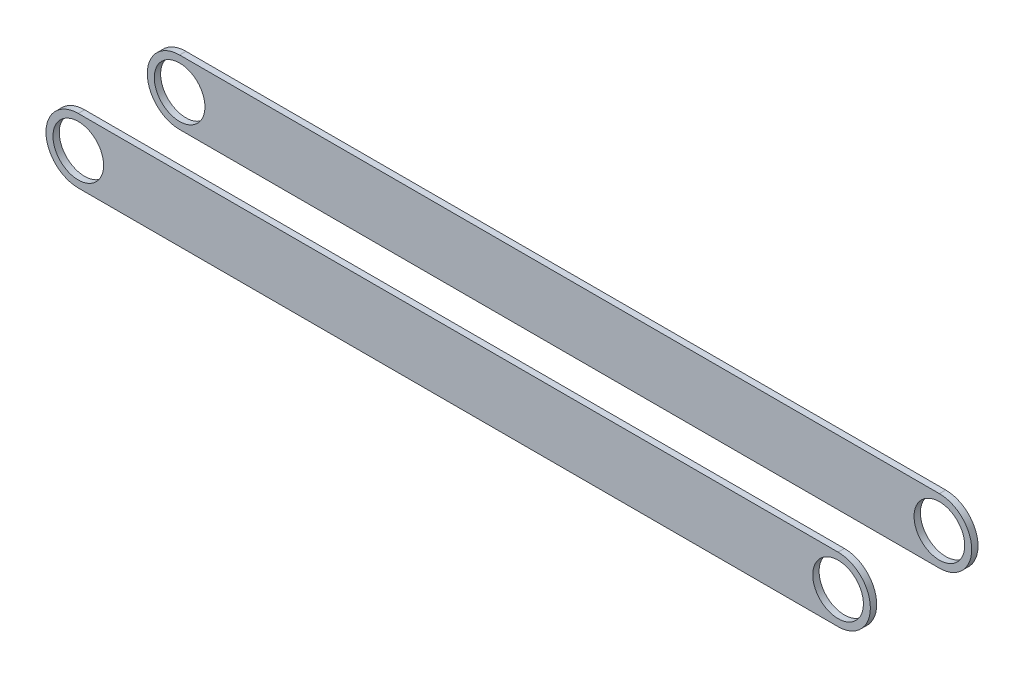
ISO-10303-21;
HEADER;
FILE_DESCRIPTION(('STEP AP214'),'2;1');
FILE_NAME('part.step','',(''),(''),'','','');
FILE_SCHEMA(('AUTOMOTIVE_DESIGN { 1 0 10303 214 1 1 1 1 }'));
ENDSEC;
DATA;
#1=APPLICATION_CONTEXT('core data for automotive mechanical design processes');
#2=APPLICATION_PROTOCOL_DEFINITION('international standard','automotive_design',2000,#1);
#3=PRODUCT_CONTEXT('',#1,'mechanical');
#4=PRODUCT('Part','Part','',(#3));
#5=PRODUCT_RELATED_PRODUCT_CATEGORY('part','',(#4));
#6=PRODUCT_DEFINITION_FORMATION('','',#4);
#7=PRODUCT_DEFINITION_CONTEXT('part definition',#1,'design');
#8=PRODUCT_DEFINITION('design','',#6,#7);
#9=PRODUCT_DEFINITION_SHAPE('','',#8);
#10=(LENGTH_UNIT() NAMED_UNIT(*) SI_UNIT(.MILLI.,.METRE.));
#11=(NAMED_UNIT(*) PLANE_ANGLE_UNIT() SI_UNIT($,.RADIAN.));
#12=(NAMED_UNIT(*) SI_UNIT($,.STERADIAN.) SOLID_ANGLE_UNIT());
#13=UNCERTAINTY_MEASURE_WITH_UNIT(LENGTH_MEASURE(1.E-05),#10,'distance_accuracy_value','');
#14=(GEOMETRIC_REPRESENTATION_CONTEXT(3) GLOBAL_UNCERTAINTY_ASSIGNED_CONTEXT((#13)) GLOBAL_UNIT_ASSIGNED_CONTEXT((#10,
#11,#12)) REPRESENTATION_CONTEXT('',''));
#15=CARTESIAN_POINT('',(0.,0.,0.));
#16=DIRECTION('',(0.,0.,1.));
#17=DIRECTION('',(1.,0.,0.));
#18=AXIS2_PLACEMENT_3D('',#15,#16,#17);
#19=CARTESIAN_POINT('',(7.24871551671669E-13,51.,160.));
#20=DIRECTION('',(0.,-1.,0.));
#21=DIRECTION('',(1.,0.,0.));
#22=AXIS2_PLACEMENT_3D('',#19,#20,#21);
#23=PLANE('',#22);
#24=DIRECTION('',(-1.,0.,0.));
#25=VECTOR('',#24,1.);
#26=CARTESIAN_POINT('',(7.24871551671669E-13,51.,170.));
#27=LINE('',#26,#25);
#28=CARTESIAN_POINT('',(7.24753589098874E-13,51.,170.));
#29=VERTEX_POINT('',#28);
#30=CARTESIAN_POINT('',(-1200.,51.0000000000171,170.));
#31=VERTEX_POINT('',#30);
#32=EDGE_CURVE('E139',#29,#31,#27,.T.);
#33=ORIENTED_EDGE('',*,*,#32,.F.);
#34=DIRECTION('',(0.,0.,1.));
#35=VECTOR('',#34,1.);
#36=CARTESIAN_POINT('',(7.24753589098874E-13,51.,160.));
#37=LINE('',#36,#35);
#38=CARTESIAN_POINT('',(7.24753589098874E-13,51.,160.));
#39=VERTEX_POINT('',#38);
#40=EDGE_CURVE('E130',#39,#29,#37,.T.);
#41=ORIENTED_EDGE('',*,*,#40,.F.);
#42=DIRECTION('',(-1.,0.,0.));
#43=VECTOR('',#42,1.);
#44=CARTESIAN_POINT('',(7.24871551671669E-13,51.,160.));
#45=LINE('',#44,#43);
#46=CARTESIAN_POINT('',(-1200.,51.0000000000171,160.));
#47=VERTEX_POINT('',#46);
#48=EDGE_CURVE('E121',#39,#47,#45,.T.);
#49=ORIENTED_EDGE('',*,*,#48,.T.);
#50=DIRECTION('',(0.,0.,1.));
#51=VECTOR('',#50,1.);
#52=CARTESIAN_POINT('',(-1200.,51.0000000000171,160.));
#53=LINE('',#52,#51);
#54=EDGE_CURVE('E12',#47,#31,#53,.T.);
#55=ORIENTED_EDGE('',*,*,#54,.T.);
#56=EDGE_LOOP('',(#33,#41,#49,#55));
#57=FACE_BOUND('',#56,.T.);
#58=ADVANCED_FACE('F59',(#57),#23,.F.);
#59=CARTESIAN_POINT('',(-1200.,1.70530256582424E-11,160.));
#60=DIRECTION('',(0.,0.,1.));
#61=DIRECTION('',(-1.,0.,0.));
#62=AXIS2_PLACEMENT_3D('',#59,#60,#61);
#63=CYLINDRICAL_SURFACE('',#62,51.);
#64=CARTESIAN_POINT('',(-1200.,1.70530256582424E-11,170.));
#65=DIRECTION('',(0.,0.,1.));
#66=DIRECTION('',(1.,0.,0.));
#67=AXIS2_PLACEMENT_3D('',#64,#65,#66);
#68=CIRCLE('',#67,51.);
#69=CARTESIAN_POINT('',(-1200.,-50.9999999999829,170.));
#70=VERTEX_POINT('',#69);
#71=EDGE_CURVE('E142',#31,#70,#68,.T.);
#72=ORIENTED_EDGE('',*,*,#71,.F.);
#73=ORIENTED_EDGE('',*,*,#54,.F.);
#74=CARTESIAN_POINT('',(-1200.,1.70530256582424E-11,160.));
#75=DIRECTION('',(0.,0.,1.));
#76=DIRECTION('',(1.,0.,0.));
#77=AXIS2_PLACEMENT_3D('',#74,#75,#76);
#78=CIRCLE('',#77,51.);
#79=CARTESIAN_POINT('',(-1200.,-50.9999999999829,160.));
#80=VERTEX_POINT('',#79);
#81=EDGE_CURVE('E102',#47,#80,#78,.T.);
#82=ORIENTED_EDGE('',*,*,#81,.T.);
#83=DIRECTION('',(0.,0.,1.));
#84=VECTOR('',#83,1.);
#85=CARTESIAN_POINT('',(-1200.,-50.9999999999829,160.));
#86=LINE('',#85,#84);
#87=EDGE_CURVE('E69',#80,#70,#86,.T.);
#88=ORIENTED_EDGE('',*,*,#87,.T.);
#89=EDGE_LOOP('',(#72,#73,#82,#88));
#90=FACE_BOUND('',#89,.T.);
#91=ADVANCED_FACE('F118',(#90),#63,.T.);
#92=CARTESIAN_POINT('',(-7.24871551671669E-13,-51.,160.));
#93=DIRECTION('',(0.,-1.,0.));
#94=DIRECTION('',(1.,0.,0.));
#95=AXIS2_PLACEMENT_3D('',#92,#93,#94);
#96=PLANE('',#95);
#97=DIRECTION('',(-1.,0.,0.));
#98=VECTOR('',#97,1.);
#99=CARTESIAN_POINT('',(-7.24871551671669E-13,-51.,170.));
#100=LINE('',#99,#98);
#101=CARTESIAN_POINT('',(-7.24753589098874E-13,-51.,170.));
#102=VERTEX_POINT('',#101);
#103=EDGE_CURVE('E113',#102,#70,#100,.T.);
#104=ORIENTED_EDGE('',*,*,#103,.T.);
#105=ORIENTED_EDGE('',*,*,#87,.F.);
#106=DIRECTION('',(-1.,0.,0.));
#107=VECTOR('',#106,1.);
#108=CARTESIAN_POINT('',(-7.24871551671669E-13,-51.,160.));
#109=LINE('',#108,#107);
#110=CARTESIAN_POINT('',(-7.24753589098874E-13,-51.,160.));
#111=VERTEX_POINT('',#110);
#112=EDGE_CURVE('E105',#111,#80,#109,.T.);
#113=ORIENTED_EDGE('',*,*,#112,.F.);
#114=DIRECTION('',(0.,0.,1.));
#115=VECTOR('',#114,1.);
#116=CARTESIAN_POINT('',(-7.24753589098874E-13,-51.,160.));
#117=LINE('',#116,#115);
#118=EDGE_CURVE('E117',#111,#102,#117,.T.);
#119=ORIENTED_EDGE('',*,*,#118,.T.);
#120=EDGE_LOOP('',(#104,#105,#113,#119));
#121=FACE_BOUND('',#120,.T.);
#122=ADVANCED_FACE('F112',(#121),#96,.T.);
#123=CARTESIAN_POINT('',(0.,0.,160.));
#124=DIRECTION('',(0.,0.,1.));
#125=DIRECTION('',(-1.,0.,0.));
#126=AXIS2_PLACEMENT_3D('',#123,#124,#125);
#127=CYLINDRICAL_SURFACE('',#126,40.);
#128=CARTESIAN_POINT('',(0.,0.,160.));
#129=DIRECTION('',(0.,0.,1.));
#130=DIRECTION('',(1.,0.,0.));
#131=AXIS2_PLACEMENT_3D('',#128,#129,#130);
#132=CIRCLE('',#131,40.);
#133=CARTESIAN_POINT('',(40.,0.,160.));
#134=VERTEX_POINT('',#133);
#135=EDGE_CURVE('E124',#134,#134,#132,.T.);
#136=ORIENTED_EDGE('',*,*,#135,.F.);
#137=EDGE_LOOP('',(#136));
#138=FACE_BOUND('',#137,.T.);
#139=CARTESIAN_POINT('',(0.,0.,170.));
#140=DIRECTION('',(0.,0.,1.));
#141=DIRECTION('',(1.,0.,0.));
#142=AXIS2_PLACEMENT_3D('',#139,#140,#141);
#143=CIRCLE('',#142,40.);
#144=CARTESIAN_POINT('',(40.,0.,170.));
#145=VERTEX_POINT('',#144);
#146=EDGE_CURVE('E135',#145,#145,#143,.T.);
#147=ORIENTED_EDGE('',*,*,#146,.T.);
#148=EDGE_LOOP('',(#147));
#149=FACE_BOUND('',#148,.T.);
#150=ADVANCED_FACE('F166',(#138,#149),#127,.F.);
#151=CARTESIAN_POINT('',(-1200.,1.70474745431193E-11,160.));
#152=DIRECTION('',(0.,0.,1.));
#153=DIRECTION('',(-1.,0.,0.));
#154=AXIS2_PLACEMENT_3D('',#151,#152,#153);
#155=CYLINDRICAL_SURFACE('',#154,39.9999999999999);
#156=CARTESIAN_POINT('',(-1200.,1.70474745431193E-11,160.));
#157=DIRECTION('',(0.,0.,1.));
#158=DIRECTION('',(1.,0.,0.));
#159=AXIS2_PLACEMENT_3D('',#156,#157,#158);
#160=CIRCLE('',#159,39.9999999999999);
#161=CARTESIAN_POINT('',(-1160.,1.70474745431193E-11,160.));
#162=VERTEX_POINT('',#161);
#163=EDGE_CURVE('E149',#162,#162,#160,.T.);
#164=ORIENTED_EDGE('',*,*,#163,.F.);
#165=EDGE_LOOP('',(#164));
#166=FACE_BOUND('',#165,.T.);
#167=CARTESIAN_POINT('',(-1200.,1.70474745431193E-11,170.));
#168=DIRECTION('',(0.,0.,1.));
#169=DIRECTION('',(1.,0.,0.));
#170=AXIS2_PLACEMENT_3D('',#167,#168,#169);
#171=CIRCLE('',#170,39.9999999999999);
#172=CARTESIAN_POINT('',(-1160.,1.70474745431193E-11,170.));
#173=VERTEX_POINT('',#172);
#174=EDGE_CURVE('E131',#173,#173,#171,.T.);
#175=ORIENTED_EDGE('',*,*,#174,.T.);
#176=EDGE_LOOP('',(#175));
#177=FACE_BOUND('',#176,.T.);
#178=ADVANCED_FACE('F61',(#166,#177),#155,.F.);
#179=CARTESIAN_POINT('',(0.,0.,160.));
#180=DIRECTION('',(0.,0.,1.));
#181=DIRECTION('',(-1.,0.,0.));
#182=AXIS2_PLACEMENT_3D('',#179,#180,#181);
#183=CYLINDRICAL_SURFACE('',#182,51.);
#184=CARTESIAN_POINT('',(0.,0.,170.));
#185=DIRECTION('',(0.,0.,1.));
#186=DIRECTION('',(1.,0.,0.));
#187=AXIS2_PLACEMENT_3D('',#184,#185,#186);
#188=CIRCLE('',#187,51.);
#189=EDGE_CURVE('E91',#102,#29,#188,.T.);
#190=ORIENTED_EDGE('',*,*,#189,.F.);
#191=ORIENTED_EDGE('',*,*,#118,.F.);
#192=CARTESIAN_POINT('',(0.,0.,160.));
#193=DIRECTION('',(0.,0.,1.));
#194=DIRECTION('',(1.,0.,0.));
#195=AXIS2_PLACEMENT_3D('',#192,#193,#194);
#196=CIRCLE('',#195,51.);
#197=EDGE_CURVE('E77',#111,#39,#196,.T.);
#198=ORIENTED_EDGE('',*,*,#197,.T.);
#199=ORIENTED_EDGE('',*,*,#40,.T.);
#200=EDGE_LOOP('',(#190,#191,#198,#199));
#201=FACE_BOUND('',#200,.T.);
#202=ADVANCED_FACE('F157',(#201),#183,.T.);
#203=CARTESIAN_POINT('',(0.,0.,160.));
#204=DIRECTION('',(0.,0.,-1.));
#205=DIRECTION('',(1.,0.,0.));
#206=AXIS2_PLACEMENT_3D('',#203,#204,#205);
#207=PLANE('',#206);
#208=ORIENTED_EDGE('',*,*,#163,.T.);
#209=EDGE_LOOP('',(#208));
#210=FACE_BOUND('',#209,.T.);
#211=ORIENTED_EDGE('',*,*,#135,.T.);
#212=EDGE_LOOP('',(#211));
#213=FACE_BOUND('',#212,.T.);
#214=ORIENTED_EDGE('',*,*,#48,.F.);
#215=ORIENTED_EDGE('',*,*,#197,.F.);
#216=ORIENTED_EDGE('',*,*,#112,.T.);
#217=ORIENTED_EDGE('',*,*,#81,.F.);
#218=EDGE_LOOP('',(#214,#215,#216,#217));
#219=FACE_BOUND('',#218,.T.);
#220=ADVANCED_FACE('F107',(#210,#213,#219),#207,.T.);
#221=CARTESIAN_POINT('',(0.,0.,170.));
#222=DIRECTION('',(0.,0.,-1.));
#223=DIRECTION('',(1.,0.,0.));
#224=AXIS2_PLACEMENT_3D('',#221,#222,#223);
#225=PLANE('',#224);
#226=ORIENTED_EDGE('',*,*,#174,.F.);
#227=EDGE_LOOP('',(#226));
#228=FACE_BOUND('',#227,.T.);
#229=ORIENTED_EDGE('',*,*,#146,.F.);
#230=EDGE_LOOP('',(#229));
#231=FACE_BOUND('',#230,.T.);
#232=ORIENTED_EDGE('',*,*,#32,.T.);
#233=ORIENTED_EDGE('',*,*,#71,.T.);
#234=ORIENTED_EDGE('',*,*,#103,.F.);
#235=ORIENTED_EDGE('',*,*,#189,.T.);
#236=EDGE_LOOP('',(#232,#233,#234,#235));
#237=FACE_BOUND('',#236,.T.);
#238=ADVANCED_FACE('F153',(#228,#231,#237),#225,.F.);
#239=CLOSED_SHELL('',(#58,#91,#122,#150,#178,#202,#220,#238));
#240=MANIFOLD_SOLID_BREP('B2',#239);
#241=CARTESIAN_POINT('',(7.24871551671669E-13,51.,10.));
#242=DIRECTION('',(0.,-1.,0.));
#243=DIRECTION('',(1.,0.,0.));
#244=AXIS2_PLACEMENT_3D('',#241,#242,#243);
#245=PLANE('',#244);
#246=DIRECTION('',(-1.,0.,0.));
#247=VECTOR('',#246,1.);
#248=CARTESIAN_POINT('',(7.24871551671669E-13,51.,0.));
#249=LINE('',#248,#247);
#250=CARTESIAN_POINT('',(7.24753589098874E-13,51.,0.));
#251=VERTEX_POINT('',#250);
#252=CARTESIAN_POINT('',(-1200.,51.0000000000171,0.));
#253=VERTEX_POINT('',#252);
#254=EDGE_CURVE('E310',#251,#253,#249,.T.);
#255=ORIENTED_EDGE('',*,*,#254,.T.);
#256=DIRECTION('',(0.,0.,-1.));
#257=VECTOR('',#256,1.);
#258=CARTESIAN_POINT('',(-1200.,51.0000000000171,10.));
#259=LINE('',#258,#257);
#260=CARTESIAN_POINT('',(-1200.,51.0000000000171,10.));
#261=VERTEX_POINT('',#260);
#262=EDGE_CURVE('E57',#261,#253,#259,.T.);
#263=ORIENTED_EDGE('',*,*,#262,.F.);
#264=DIRECTION('',(-1.,0.,0.));
#265=VECTOR('',#264,1.);
#266=CARTESIAN_POINT('',(7.24871551671669E-13,51.,10.));
#267=LINE('',#266,#265);
#268=CARTESIAN_POINT('',(7.24753589098874E-13,51.,10.));
#269=VERTEX_POINT('',#268);
#270=EDGE_CURVE('E289',#269,#261,#267,.T.);
#271=ORIENTED_EDGE('',*,*,#270,.F.);
#272=DIRECTION('',(0.,0.,-1.));
#273=VECTOR('',#272,1.);
#274=CARTESIAN_POINT('',(7.24753589098874E-13,51.,10.));
#275=LINE('',#274,#273);
#276=EDGE_CURVE('E300',#269,#251,#275,.T.);
#277=ORIENTED_EDGE('',*,*,#276,.T.);
#278=EDGE_LOOP('',(#255,#263,#271,#277));
#279=FACE_BOUND('',#278,.T.);
#280=ADVANCED_FACE('F241',(#279),#245,.F.);
#281=CARTESIAN_POINT('',(-1200.,1.70530256582424E-11,10.));
#282=DIRECTION('',(0.,0.,-1.));
#283=DIRECTION('',(-1.,0.,0.));
#284=AXIS2_PLACEMENT_3D('',#281,#282,#283);
#285=CYLINDRICAL_SURFACE('',#284,51.);
#286=CARTESIAN_POINT('',(-1200.,1.70530256582424E-11,0.));
#287=DIRECTION('',(0.,0.,1.));
#288=DIRECTION('',(1.,0.,0.));
#289=AXIS2_PLACEMENT_3D('',#286,#287,#288);
#290=CIRCLE('',#289,51.);
#291=CARTESIAN_POINT('',(-1200.,-50.9999999999829,0.));
#292=VERTEX_POINT('',#291);
#293=EDGE_CURVE('E294',#253,#292,#290,.T.);
#294=ORIENTED_EDGE('',*,*,#293,.T.);
#295=DIRECTION('',(0.,0.,-1.));
#296=VECTOR('',#295,1.);
#297=CARTESIAN_POINT('',(-1200.,-50.9999999999829,10.));
#298=LINE('',#297,#296);
#299=CARTESIAN_POINT('',(-1200.,-50.9999999999829,10.));
#300=VERTEX_POINT('',#299);
#301=EDGE_CURVE('E250',#300,#292,#298,.T.);
#302=ORIENTED_EDGE('',*,*,#301,.F.);
#303=CARTESIAN_POINT('',(-1200.,1.70530256582424E-11,10.));
#304=DIRECTION('',(0.,0.,1.));
#305=DIRECTION('',(1.,0.,0.));
#306=AXIS2_PLACEMENT_3D('',#303,#304,#305);
#307=CIRCLE('',#306,51.);
#308=EDGE_CURVE('E284',#261,#300,#307,.T.);
#309=ORIENTED_EDGE('',*,*,#308,.F.);
#310=ORIENTED_EDGE('',*,*,#262,.T.);
#311=EDGE_LOOP('',(#294,#302,#309,#310));
#312=FACE_BOUND('',#311,.T.);
#313=ADVANCED_FACE('F293',(#312),#285,.T.);
#314=CARTESIAN_POINT('',(-7.24871551671669E-13,-51.,10.));
#315=DIRECTION('',(0.,-1.,0.));
#316=DIRECTION('',(1.,0.,0.));
#317=AXIS2_PLACEMENT_3D('',#314,#315,#316);
#318=PLANE('',#317);
#319=DIRECTION('',(-1.,0.,0.));
#320=VECTOR('',#319,1.);
#321=CARTESIAN_POINT('',(-7.24871551671669E-13,-51.,0.));
#322=LINE('',#321,#320);
#323=CARTESIAN_POINT('',(-7.24753589098874E-13,-51.,0.));
#324=VERTEX_POINT('',#323);
#325=EDGE_CURVE('E314',#324,#292,#322,.T.);
#326=ORIENTED_EDGE('',*,*,#325,.F.);
#327=DIRECTION('',(0.,0.,-1.));
#328=VECTOR('',#327,1.);
#329=CARTESIAN_POINT('',(-7.24753589098874E-13,-51.,10.));
#330=LINE('',#329,#328);
#331=CARTESIAN_POINT('',(-7.24753589098874E-13,-51.,10.));
#332=VERTEX_POINT('',#331);
#333=EDGE_CURVE('E274',#332,#324,#330,.T.);
#334=ORIENTED_EDGE('',*,*,#333,.F.);
#335=DIRECTION('',(-1.,0.,0.));
#336=VECTOR('',#335,1.);
#337=CARTESIAN_POINT('',(-7.24871551671669E-13,-51.,10.));
#338=LINE('',#337,#336);
#339=EDGE_CURVE('E287',#332,#300,#338,.T.);
#340=ORIENTED_EDGE('',*,*,#339,.T.);
#341=ORIENTED_EDGE('',*,*,#301,.T.);
#342=EDGE_LOOP('',(#326,#334,#340,#341));
#343=FACE_BOUND('',#342,.T.);
#344=ADVANCED_FACE('F298',(#343),#318,.T.);
#345=CARTESIAN_POINT('',(0.,0.,10.));
#346=DIRECTION('',(0.,0.,-1.));
#347=DIRECTION('',(-1.,0.,0.));
#348=AXIS2_PLACEMENT_3D('',#345,#346,#347);
#349=CYLINDRICAL_SURFACE('',#348,40.);
#350=CARTESIAN_POINT('',(0.,0.,10.));
#351=DIRECTION('',(0.,0.,1.));
#352=DIRECTION('',(1.,0.,0.));
#353=AXIS2_PLACEMENT_3D('',#350,#351,#352);
#354=CIRCLE('',#353,40.);
#355=CARTESIAN_POINT('',(40.,0.,10.));
#356=VERTEX_POINT('',#355);
#357=EDGE_CURVE('E352',#356,#356,#354,.T.);
#358=ORIENTED_EDGE('',*,*,#357,.T.);
#359=EDGE_LOOP('',(#358));
#360=FACE_BOUND('',#359,.T.);
#361=CARTESIAN_POINT('',(0.,0.,0.));
#362=DIRECTION('',(0.,0.,1.));
#363=DIRECTION('',(1.,0.,0.));
#364=AXIS2_PLACEMENT_3D('',#361,#362,#363);
#365=CIRCLE('',#364,40.);
#366=CARTESIAN_POINT('',(40.,0.,0.));
#367=VERTEX_POINT('',#366);
#368=EDGE_CURVE('E307',#367,#367,#365,.T.);
#369=ORIENTED_EDGE('',*,*,#368,.F.);
#370=EDGE_LOOP('',(#369));
#371=FACE_BOUND('',#370,.T.);
#372=ADVANCED_FACE('F341',(#360,#371),#349,.F.);
#373=CARTESIAN_POINT('',(-1200.,1.70474745431193E-11,10.));
#374=DIRECTION('',(0.,0.,-1.));
#375=DIRECTION('',(-1.,0.,0.));
#376=AXIS2_PLACEMENT_3D('',#373,#374,#375);
#377=CYLINDRICAL_SURFACE('',#376,39.9999999999999);
#378=CARTESIAN_POINT('',(-1200.,1.70474745431193E-11,10.));
#379=DIRECTION('',(0.,0.,1.));
#380=DIRECTION('',(1.,0.,0.));
#381=AXIS2_PLACEMENT_3D('',#378,#379,#380);
#382=CIRCLE('',#381,39.9999999999999);
#383=CARTESIAN_POINT('',(-1160.,1.70474745431193E-11,10.));
#384=VERTEX_POINT('',#383);
#385=EDGE_CURVE('E317',#384,#384,#382,.T.);
#386=ORIENTED_EDGE('',*,*,#385,.T.);
#387=EDGE_LOOP('',(#386));
#388=FACE_BOUND('',#387,.T.);
#389=CARTESIAN_POINT('',(-1200.,1.70474745431193E-11,0.));
#390=DIRECTION('',(0.,0.,1.));
#391=DIRECTION('',(1.,0.,0.));
#392=AXIS2_PLACEMENT_3D('',#389,#390,#391);
#393=CIRCLE('',#392,39.9999999999999);
#394=CARTESIAN_POINT('',(-1160.,1.70474745431193E-11,0.));
#395=VERTEX_POINT('',#394);
#396=EDGE_CURVE('E304',#395,#395,#393,.T.);
#397=ORIENTED_EDGE('',*,*,#396,.F.);
#398=EDGE_LOOP('',(#397));
#399=FACE_BOUND('',#398,.T.);
#400=ADVANCED_FACE('F243',(#388,#399),#377,.F.);
#401=CARTESIAN_POINT('',(0.,0.,10.));
#402=DIRECTION('',(0.,0.,-1.));
#403=DIRECTION('',(-1.,0.,0.));
#404=AXIS2_PLACEMENT_3D('',#401,#402,#403);
#405=CYLINDRICAL_SURFACE('',#404,51.);
#406=CARTESIAN_POINT('',(0.,0.,0.));
#407=DIRECTION('',(0.,0.,1.));
#408=DIRECTION('',(1.,0.,0.));
#409=AXIS2_PLACEMENT_3D('',#406,#407,#408);
#410=CIRCLE('',#409,51.);
#411=EDGE_CURVE('E277',#324,#251,#410,.T.);
#412=ORIENTED_EDGE('',*,*,#411,.T.);
#413=ORIENTED_EDGE('',*,*,#276,.F.);
#414=CARTESIAN_POINT('',(0.,0.,10.));
#415=DIRECTION('',(0.,0.,1.));
#416=DIRECTION('',(1.,0.,0.));
#417=AXIS2_PLACEMENT_3D('',#414,#415,#416);
#418=CIRCLE('',#417,51.);
#419=EDGE_CURVE('E258',#332,#269,#418,.T.);
#420=ORIENTED_EDGE('',*,*,#419,.F.);
#421=ORIENTED_EDGE('',*,*,#333,.T.);
#422=EDGE_LOOP('',(#412,#413,#420,#421));
#423=FACE_BOUND('',#422,.T.);
#424=ADVANCED_FACE('F329',(#423),#405,.T.);
#425=CARTESIAN_POINT('',(0.,0.,10.));
#426=DIRECTION('',(0.,0.,1.));
#427=DIRECTION('',(1.,0.,0.));
#428=AXIS2_PLACEMENT_3D('',#425,#426,#427);
#429=PLANE('',#428);
#430=ORIENTED_EDGE('',*,*,#385,.F.);
#431=EDGE_LOOP('',(#430));
#432=FACE_BOUND('',#431,.T.);
#433=ORIENTED_EDGE('',*,*,#357,.F.);
#434=EDGE_LOOP('',(#433));
#435=FACE_BOUND('',#434,.T.);
#436=ORIENTED_EDGE('',*,*,#270,.T.);
#437=ORIENTED_EDGE('',*,*,#308,.T.);
#438=ORIENTED_EDGE('',*,*,#339,.F.);
#439=ORIENTED_EDGE('',*,*,#419,.T.);
#440=EDGE_LOOP('',(#436,#437,#438,#439));
#441=FACE_BOUND('',#440,.T.);
#442=ADVANCED_FACE('F285',(#432,#435,#441),#429,.T.);
#443=CARTESIAN_POINT('',(0.,0.,0.));
#444=DIRECTION('',(0.,0.,1.));
#445=DIRECTION('',(1.,0.,0.));
#446=AXIS2_PLACEMENT_3D('',#443,#444,#445);
#447=PLANE('',#446);
#448=ORIENTED_EDGE('',*,*,#396,.T.);
#449=EDGE_LOOP('',(#448));
#450=FACE_BOUND('',#449,.T.);
#451=ORIENTED_EDGE('',*,*,#368,.T.);
#452=EDGE_LOOP('',(#451));
#453=FACE_BOUND('',#452,.T.);
#454=ORIENTED_EDGE('',*,*,#254,.F.);
#455=ORIENTED_EDGE('',*,*,#411,.F.);
#456=ORIENTED_EDGE('',*,*,#325,.T.);
#457=ORIENTED_EDGE('',*,*,#293,.F.);
#458=EDGE_LOOP('',(#454,#455,#456,#457));
#459=FACE_BOUND('',#458,.T.);
#460=ADVANCED_FACE('F322',(#450,#453,#459),#447,.F.);
#461=CLOSED_SHELL('',(#280,#313,#344,#372,#400,#424,#442,#460));
#462=MANIFOLD_SOLID_BREP('B6',#461);
#463=ADVANCED_BREP_SHAPE_REPRESENTATION('',(#18,#240,#462),#14);
#464=SHAPE_DEFINITION_REPRESENTATION(#9,#463);
ENDSEC;
END-ISO-10303-21;
